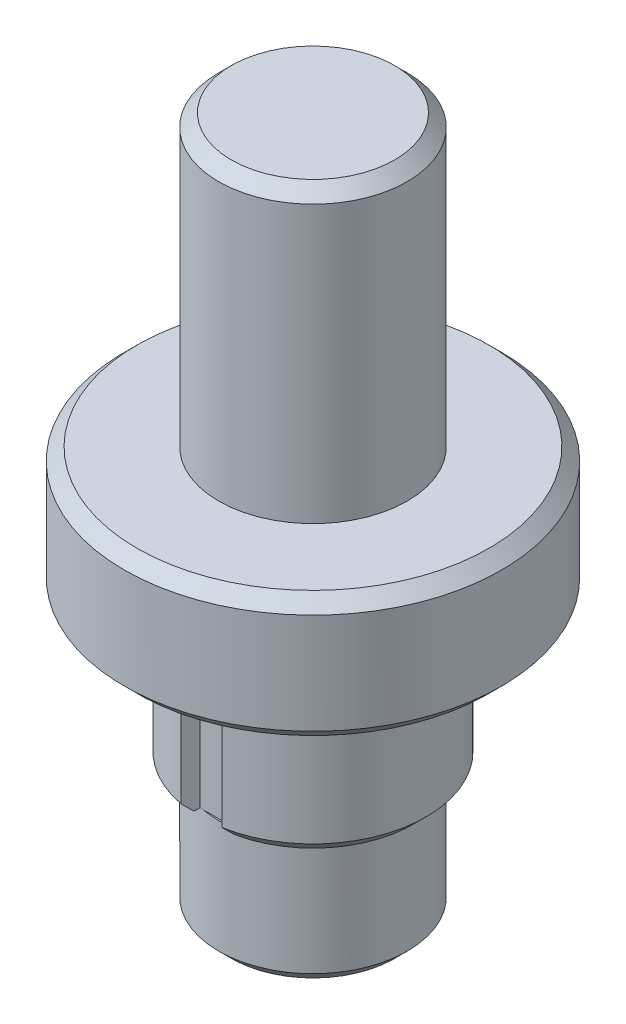
ISO-10303-21;
HEADER;
FILE_DESCRIPTION(('STEP AP214'),'2;1');
FILE_NAME('part.step','',(''),(''),'','','');
FILE_SCHEMA(('AUTOMOTIVE_DESIGN { 1 0 10303 214 1 1 1 1 }'));
ENDSEC;
DATA;
#1=APPLICATION_CONTEXT('core data for automotive mechanical design processes');
#2=APPLICATION_PROTOCOL_DEFINITION('international standard','automotive_design',2000,#1);
#3=PRODUCT_CONTEXT('',#1,'mechanical');
#4=PRODUCT('Part','Part','',(#3));
#5=PRODUCT_RELATED_PRODUCT_CATEGORY('part','',(#4));
#6=PRODUCT_DEFINITION_FORMATION('','',#4);
#7=PRODUCT_DEFINITION_CONTEXT('part definition',#1,'design');
#8=PRODUCT_DEFINITION('design','',#6,#7);
#9=PRODUCT_DEFINITION_SHAPE('','',#8);
#10=(LENGTH_UNIT() NAMED_UNIT(*) SI_UNIT(.MILLI.,.METRE.));
#11=(NAMED_UNIT(*) PLANE_ANGLE_UNIT() SI_UNIT($,.RADIAN.));
#12=(NAMED_UNIT(*) SI_UNIT($,.STERADIAN.) SOLID_ANGLE_UNIT());
#13=UNCERTAINTY_MEASURE_WITH_UNIT(LENGTH_MEASURE(1.E-05),#10,'distance_accuracy_value','');
#14=(GEOMETRIC_REPRESENTATION_CONTEXT(3) GLOBAL_UNCERTAINTY_ASSIGNED_CONTEXT((#13)) GLOBAL_UNIT_ASSIGNED_CONTEXT((#10,
#11,#12)) REPRESENTATION_CONTEXT('',''));
#15=CARTESIAN_POINT('',(0.,0.,0.));
#16=DIRECTION('',(0.,0.,1.));
#17=DIRECTION('',(1.,0.,0.));
#18=AXIS2_PLACEMENT_3D('',#15,#16,#17);
#19=CARTESIAN_POINT('',(7.5,0.,0.));
#20=DIRECTION('',(0.,-1.,0.));
#21=DIRECTION('',(0.,0.,-1.));
#22=AXIS2_PLACEMENT_3D('',#19,#20,#21);
#23=PLANE('',#22);
#24=CARTESIAN_POINT('',(0.,0.,0.));
#25=DIRECTION('',(0.,-1.,0.));
#26=DIRECTION('',(0.,0.,-1.));
#27=AXIS2_PLACEMENT_3D('',#24,#25,#26);
#28=CIRCLE('',#27,6.50000000000001);
#29=CARTESIAN_POINT('',(0.,0.,-6.50000000000001));
#30=VERTEX_POINT('',#29);
#31=EDGE_CURVE('E154',#30,#30,#28,.T.);
#32=ORIENTED_EDGE('',*,*,#31,.T.);
#33=EDGE_LOOP('',(#32));
#34=FACE_BOUND('',#33,.T.);
#35=ADVANCED_FACE('F33',(#34),#23,.T.);
#36=CARTESIAN_POINT('',(0.,55.,0.));
#37=DIRECTION('',(0.,1.,0.));
#38=DIRECTION('',(0.,0.,1.));
#39=AXIS2_PLACEMENT_3D('',#36,#37,#38);
#40=PLANE('',#39);
#41=CARTESIAN_POINT('',(0.,55.,0.));
#42=DIRECTION('',(0.,1.,0.));
#43=DIRECTION('',(0.,0.,1.));
#44=AXIS2_PLACEMENT_3D('',#41,#42,#43);
#45=CIRCLE('',#44,6.50000000000001);
#46=CARTESIAN_POINT('',(0.,55.,6.50000000000001));
#47=VERTEX_POINT('',#46);
#48=EDGE_CURVE('E151',#47,#47,#45,.T.);
#49=ORIENTED_EDGE('',*,*,#48,.T.);
#50=EDGE_LOOP('',(#49));
#51=FACE_BOUND('',#50,.T.);
#52=ADVANCED_FACE('F199',(#51),#40,.T.);
#53=CARTESIAN_POINT('',(0.,0.,0.));
#54=DIRECTION('',(0.,-1.,0.));
#55=DIRECTION('',(0.,0.,-1.));
#56=AXIS2_PLACEMENT_3D('',#53,#54,#55);
#57=CYLINDRICAL_SURFACE('',#56,7.5);
#58=CARTESIAN_POINT('',(0.,54.,0.));
#59=DIRECTION('',(0.,1.,0.));
#60=DIRECTION('',(0.,0.,1.));
#61=AXIS2_PLACEMENT_3D('',#58,#59,#60);
#62=CIRCLE('',#61,7.5);
#63=CARTESIAN_POINT('',(0.,54.,7.50000000000001));
#64=VERTEX_POINT('',#63);
#65=EDGE_CURVE('E144',#64,#64,#62,.F.);
#66=ORIENTED_EDGE('',*,*,#65,.T.);
#67=EDGE_LOOP('',(#66));
#68=FACE_BOUND('',#67,.T.);
#69=CARTESIAN_POINT('',(0.,32.,0.));
#70=DIRECTION('',(0.,-1.,0.));
#71=DIRECTION('',(0.,0.,-1.));
#72=AXIS2_PLACEMENT_3D('',#69,#70,#71);
#73=CIRCLE('',#72,7.5);
#74=CARTESIAN_POINT('',(0.,32.,-7.50000000000001));
#75=VERTEX_POINT('',#74);
#76=EDGE_CURVE('E140',#75,#75,#73,.T.);
#77=ORIENTED_EDGE('',*,*,#76,.F.);
#78=EDGE_LOOP('',(#77));
#79=FACE_BOUND('',#78,.T.);
#80=ADVANCED_FACE('F195',(#68,#79),#57,.T.);
#81=CARTESIAN_POINT('',(15.,32.,0.));
#82=DIRECTION('',(0.,1.,0.));
#83=DIRECTION('',(0.,0.,1.));
#84=AXIS2_PLACEMENT_3D('',#81,#82,#83);
#85=PLANE('',#84);
#86=CARTESIAN_POINT('',(0.,32.,0.));
#87=DIRECTION('',(0.,1.,0.));
#88=DIRECTION('',(0.,0.,1.));
#89=AXIS2_PLACEMENT_3D('',#86,#87,#88);
#90=CIRCLE('',#89,14.);
#91=CARTESIAN_POINT('',(0.,32.,14.));
#92=VERTEX_POINT('',#91);
#93=EDGE_CURVE('E11',#92,#92,#90,.T.);
#94=ORIENTED_EDGE('',*,*,#93,.T.);
#95=EDGE_LOOP('',(#94));
#96=FACE_BOUND('',#95,.T.);
#97=ORIENTED_EDGE('',*,*,#76,.T.);
#98=EDGE_LOOP('',(#97));
#99=FACE_BOUND('',#98,.T.);
#100=ADVANCED_FACE('F191',(#96,#99),#85,.T.);
#101=CARTESIAN_POINT('',(0.,0.,0.));
#102=DIRECTION('',(0.,-1.,0.));
#103=DIRECTION('',(0.,0.,-1.));
#104=AXIS2_PLACEMENT_3D('',#101,#102,#103);
#105=CYLINDRICAL_SURFACE('',#104,15.);
#106=CARTESIAN_POINT('',(0.,23.,0.));
#107=DIRECTION('',(0.,-1.,0.));
#108=DIRECTION('',(0.,0.,-1.));
#109=AXIS2_PLACEMENT_3D('',#106,#107,#108);
#110=CIRCLE('',#109,15.);
#111=CARTESIAN_POINT('',(0.,23.,-15.));
#112=VERTEX_POINT('',#111);
#113=EDGE_CURVE('E41',#112,#112,#110,.F.);
#114=ORIENTED_EDGE('',*,*,#113,.T.);
#115=EDGE_LOOP('',(#114));
#116=FACE_BOUND('',#115,.T.);
#117=CARTESIAN_POINT('',(0.,31.,0.));
#118=DIRECTION('',(0.,1.,0.));
#119=DIRECTION('',(0.,0.,1.));
#120=AXIS2_PLACEMENT_3D('',#117,#118,#119);
#121=CIRCLE('',#120,15.);
#122=CARTESIAN_POINT('',(0.,31.,15.));
#123=VERTEX_POINT('',#122);
#124=EDGE_CURVE('E268',#123,#123,#121,.F.);
#125=ORIENTED_EDGE('',*,*,#124,.T.);
#126=EDGE_LOOP('',(#125));
#127=FACE_BOUND('',#126,.T.);
#128=ADVANCED_FACE('F187',(#116,#127),#105,.T.);
#129=CARTESIAN_POINT('',(9.00000000000002,22.,0.));
#130=DIRECTION('',(0.,-1.,0.));
#131=DIRECTION('',(0.,0.,-1.));
#132=AXIS2_PLACEMENT_3D('',#129,#130,#131);
#133=PLANE('',#132);
#134=CARTESIAN_POINT('',(0.,22.,0.));
#135=DIRECTION('',(0.,-1.,0.));
#136=DIRECTION('',(0.,0.,-1.));
#137=AXIS2_PLACEMENT_3D('',#134,#135,#136);
#138=CIRCLE('',#137,14.);
#139=CARTESIAN_POINT('',(0.,22.,-14.));
#140=VERTEX_POINT('',#139);
#141=EDGE_CURVE('E270',#140,#140,#138,.T.);
#142=ORIENTED_EDGE('',*,*,#141,.T.);
#143=EDGE_LOOP('',(#142));
#144=FACE_BOUND('',#143,.T.);
#145=CARTESIAN_POINT('',(0.,22.,0.));
#146=DIRECTION('',(0.,-1.,0.));
#147=DIRECTION('',(0.,0.,-1.));
#148=AXIS2_PLACEMENT_3D('',#145,#146,#147);
#149=CIRCLE('',#148,9.00000000000001);
#150=CARTESIAN_POINT('',(-1.62499999999999,22.,8.85208308817762));
#151=VERTEX_POINT('',#150);
#152=CARTESIAN_POINT('',(1.625,22.,8.85208308817762));
#153=VERTEX_POINT('',#152);
#154=EDGE_CURVE('E136',#151,#153,#149,.T.);
#155=ORIENTED_EDGE('',*,*,#154,.F.);
#156=DIRECTION('',(0.,0.,1.));
#157=VECTOR('',#156,1.);
#158=CARTESIAN_POINT('',(-1.625,22.,10.625));
#159=LINE('',#158,#157);
#160=CARTESIAN_POINT('',(-1.62499999999999,22.,7.37500000000001));
#161=VERTEX_POINT('',#160);
#162=EDGE_CURVE('E125',#161,#151,#159,.T.);
#163=ORIENTED_EDGE('',*,*,#162,.F.);
#164=DIRECTION('',(-1.,0.,0.));
#165=VECTOR('',#164,1.);
#166=CARTESIAN_POINT('',(-1.62499999999999,22.,7.37500000000001));
#167=LINE('',#166,#165);
#168=CARTESIAN_POINT('',(1.62500000000002,22.,7.37500000000002));
#169=VERTEX_POINT('',#168);
#170=EDGE_CURVE('E107',#169,#161,#167,.T.);
#171=ORIENTED_EDGE('',*,*,#170,.F.);
#172=DIRECTION('',(0.,0.,-1.));
#173=VECTOR('',#172,1.);
#174=CARTESIAN_POINT('',(1.625,22.,10.625));
#175=LINE('',#174,#173);
#176=EDGE_CURVE('E124',#153,#169,#175,.T.);
#177=ORIENTED_EDGE('',*,*,#176,.F.);
#178=EDGE_LOOP('',(#155,#163,#171,#177));
#179=FACE_BOUND('',#178,.T.);
#180=ADVANCED_FACE('F139',(#144,#179),#133,.T.);
#181=CARTESIAN_POINT('',(0.,0.,0.));
#182=DIRECTION('',(0.,-1.,0.));
#183=DIRECTION('',(0.,0.,-1.));
#184=AXIS2_PLACEMENT_3D('',#181,#182,#183);
#185=CYLINDRICAL_SURFACE('',#184,9.00000000000001);
#186=DIRECTION('',(0.,-1.,0.));
#187=VECTOR('',#186,1.);
#188=CARTESIAN_POINT('',(1.625,0.,8.85208308817762));
#189=LINE('',#188,#187);
#190=CARTESIAN_POINT('',(1.625,11.,8.85208308817762));
#191=VERTEX_POINT('',#190);
#192=EDGE_CURVE('E137',#191,#153,#189,.F.);
#193=ORIENTED_EDGE('',*,*,#192,.F.);
#194=CARTESIAN_POINT('',(0.,11.,0.));
#195=DIRECTION('',(0.,-1.,0.));
#196=DIRECTION('',(0.,0.,-1.));
#197=AXIS2_PLACEMENT_3D('',#194,#195,#196);
#198=CIRCLE('',#197,9.00000000000001);
#199=CARTESIAN_POINT('',(-1.62499999999999,11.,8.85208308817762));
#200=VERTEX_POINT('',#199);
#201=EDGE_CURVE('E48',#191,#200,#198,.F.);
#202=ORIENTED_EDGE('',*,*,#201,.T.);
#203=DIRECTION('',(0.,-1.,0.));
#204=VECTOR('',#203,1.);
#205=CARTESIAN_POINT('',(-1.62499999999999,0.,8.85208308817762));
#206=LINE('',#205,#204);
#207=EDGE_CURVE('E130',#151,#200,#206,.T.);
#208=ORIENTED_EDGE('',*,*,#207,.F.);
#209=ORIENTED_EDGE('',*,*,#154,.T.);
#210=EDGE_LOOP('',(#193,#202,#208,#209));
#211=FACE_BOUND('',#210,.T.);
#212=ADVANCED_FACE('F135',(#211),#185,.T.);
#213=CARTESIAN_POINT('',(9.00000000000002,10.,0.));
#214=DIRECTION('',(0.,-1.,0.));
#215=DIRECTION('',(0.,0.,-1.));
#216=AXIS2_PLACEMENT_3D('',#213,#214,#215);
#217=PLANE('',#216);
#218=DIRECTION('',(0.,0.,-1.));
#219=VECTOR('',#218,1.);
#220=CARTESIAN_POINT('',(-1.625,10.,10.625));
#221=LINE('',#220,#219);
#222=CARTESIAN_POINT('',(-1.62500000000001,10.,7.83322251694667));
#223=VERTEX_POINT('',#222);
#224=CARTESIAN_POINT('',(-1.62499999999999,10.,7.37500000000001));
#225=VERTEX_POINT('',#224);
#226=EDGE_CURVE('E87',#223,#225,#221,.T.);
#227=ORIENTED_EDGE('',*,*,#226,.F.);
#228=CARTESIAN_POINT('',(0.,10.,0.));
#229=DIRECTION('',(0.,-1.,0.));
#230=DIRECTION('',(0.,0.,-1.));
#231=AXIS2_PLACEMENT_3D('',#228,#229,#230);
#232=CIRCLE('',#231,8.00000000000001);
#233=CARTESIAN_POINT('',(1.62499999999999,10.,7.83322251694666));
#234=VERTEX_POINT('',#233);
#235=EDGE_CURVE('E126',#223,#234,#232,.T.);
#236=ORIENTED_EDGE('',*,*,#235,.T.);
#237=DIRECTION('',(0.,0.,1.));
#238=VECTOR('',#237,1.);
#239=CARTESIAN_POINT('',(1.625,10.,10.625));
#240=LINE('',#239,#238);
#241=CARTESIAN_POINT('',(1.62500000000002,10.,7.37500000000002));
#242=VERTEX_POINT('',#241);
#243=EDGE_CURVE('E98',#242,#234,#240,.T.);
#244=ORIENTED_EDGE('',*,*,#243,.F.);
#245=DIRECTION('',(1.,0.,0.));
#246=VECTOR('',#245,1.);
#247=CARTESIAN_POINT('',(-1.62499999999999,10.,7.37500000000001));
#248=LINE('',#247,#246);
#249=CARTESIAN_POINT('',(1.36358901432942,10.,7.37500000000002));
#250=VERTEX_POINT('',#249);
#251=EDGE_CURVE('E97',#250,#242,#248,.T.);
#252=ORIENTED_EDGE('',*,*,#251,.F.);
#253=CARTESIAN_POINT('',(0.,10.,0.));
#254=DIRECTION('',(0.,-1.,0.));
#255=DIRECTION('',(0.,0.,-1.));
#256=AXIS2_PLACEMENT_3D('',#253,#254,#255);
#257=CIRCLE('',#256,7.5);
#258=CARTESIAN_POINT('',(-1.36358901432944,10.,7.37500000000001));
#259=VERTEX_POINT('',#258);
#260=EDGE_CURVE('E115',#259,#250,#257,.T.);
#261=ORIENTED_EDGE('',*,*,#260,.F.);
#262=EDGE_CURVE('E103',#225,#259,#248,.T.);
#263=ORIENTED_EDGE('',*,*,#262,.F.);
#264=EDGE_LOOP('',(#227,#236,#244,#252,#261,#263));
#265=FACE_BOUND('',#264,.T.);
#266=ADVANCED_FACE('F112',(#265),#217,.T.);
#267=CARTESIAN_POINT('',(0.,0.,0.));
#268=DIRECTION('',(0.,-1.,0.));
#269=DIRECTION('',(0.,0.,-1.));
#270=AXIS2_PLACEMENT_3D('',#267,#268,#269);
#271=CYLINDRICAL_SURFACE('',#270,7.5);
#272=CARTESIAN_POINT('',(0.,1.,0.));
#273=DIRECTION('',(0.,-1.,0.));
#274=DIRECTION('',(0.,0.,-1.));
#275=AXIS2_PLACEMENT_3D('',#272,#273,#274);
#276=CIRCLE('',#275,7.5);
#277=CARTESIAN_POINT('',(0.,1.,-7.50000000000001));
#278=VERTEX_POINT('',#277);
#279=EDGE_CURVE('E157',#278,#278,#276,.F.);
#280=ORIENTED_EDGE('',*,*,#279,.T.);
#281=EDGE_LOOP('',(#280));
#282=FACE_BOUND('',#281,.T.);
#283=EDGE_CURVE('E141',#250,#259,#257,.T.);
#284=ORIENTED_EDGE('',*,*,#283,.T.);
#285=ORIENTED_EDGE('',*,*,#260,.T.);
#286=EDGE_LOOP('',(#284,#285));
#287=FACE_BOUND('',#286,.T.);
#288=ADVANCED_FACE('F175',(#282,#287),#271,.T.);
#289=CARTESIAN_POINT('',(1.625,26.5961940777126,10.625));
#290=DIRECTION('',(1.,0.,0.));
#291=DIRECTION('',(0.,0.,-1.));
#292=AXIS2_PLACEMENT_3D('',#289,#290,#291);
#293=PLANE('',#292);
#294=ORIENTED_EDGE('',*,*,#243,.T.);
#295=CARTESIAN_POINT('',(1.62499999999999,10.,7.83322251694666));
#296=CARTESIAN_POINT('',(1.625,10.1664765311696,8.00321923411533));
#297=CARTESIAN_POINT('',(1.625,10.3330481316261,8.17312264186607));
#298=CARTESIAN_POINT('',(1.625,10.6663814649664,8.51274283226951));
#299=CARTESIAN_POINT('',(1.625,10.8331431978433,8.68245961492909));
#300=CARTESIAN_POINT('',(1.625,11.,8.85208308817762));
#301=B_SPLINE_CURVE_WITH_KNOTS('',3,(#295,#296,#297,#298,#299,#300),.UNSPECIFIED.,.F.,.F.,(4,2,
4),(0.,0.713806272314463,1.42761251830545),.UNSPECIFIED.);
#302=EDGE_CURVE('E56',#234,#191,#301,.T.);
#303=ORIENTED_EDGE('',*,*,#302,.T.);
#304=ORIENTED_EDGE('',*,*,#192,.T.);
#305=ORIENTED_EDGE('',*,*,#176,.T.);
#306=DIRECTION('',(0.,-1.,0.));
#307=VECTOR('',#306,1.);
#308=CARTESIAN_POINT('',(1.62500000000002,26.5961940777126,7.37500000000002));
#309=LINE('',#308,#307);
#310=EDGE_CURVE('E109',#169,#242,#309,.T.);
#311=ORIENTED_EDGE('',*,*,#310,.T.);
#312=EDGE_LOOP('',(#294,#303,#304,#305,#311));
#313=FACE_BOUND('',#312,.T.);
#314=ADVANCED_FACE('F122',(#313),#293,.F.);
#315=CARTESIAN_POINT('',(-1.62499999999999,26.5961940777126,7.37500000000001));
#316=DIRECTION('',(0.,0.,-1.));
#317=DIRECTION('',(-1.,0.,0.));
#318=AXIS2_PLACEMENT_3D('',#315,#316,#317);
#319=PLANE('',#318);
#320=ORIENTED_EDGE('',*,*,#170,.T.);
#321=DIRECTION('',(0.,-1.,0.));
#322=VECTOR('',#321,1.);
#323=CARTESIAN_POINT('',(-1.62499999999999,26.5961940777126,7.37500000000001));
#324=LINE('',#323,#322);
#325=EDGE_CURVE('E90',#161,#225,#324,.T.);
#326=ORIENTED_EDGE('',*,*,#325,.T.);
#327=ORIENTED_EDGE('',*,*,#262,.T.);
#328=EDGE_CURVE('E117',#259,#250,#248,.T.);
#329=ORIENTED_EDGE('',*,*,#328,.T.);
#330=ORIENTED_EDGE('',*,*,#251,.T.);
#331=ORIENTED_EDGE('',*,*,#310,.F.);
#332=EDGE_LOOP('',(#320,#326,#327,#329,#330,#331));
#333=FACE_BOUND('',#332,.T.);
#334=ADVANCED_FACE('F101',(#333),#319,.F.);
#335=CARTESIAN_POINT('',(-1.625,26.5961940777126,10.625));
#336=DIRECTION('',(-1.,0.,0.));
#337=DIRECTION('',(0.,0.,1.));
#338=AXIS2_PLACEMENT_3D('',#335,#336,#337);
#339=PLANE('',#338);
#340=ORIENTED_EDGE('',*,*,#207,.T.);
#341=CARTESIAN_POINT('',(-1.62499999999999,11.,8.85208308817762));
#342=CARTESIAN_POINT('',(-1.625,10.8331431978433,8.68245961492909));
#343=CARTESIAN_POINT('',(-1.625,10.6663814649664,8.51274283226951));
#344=CARTESIAN_POINT('',(-1.625,10.3330481316261,8.17312264186607));
#345=CARTESIAN_POINT('',(-1.62500000000001,10.1664765311696,8.00321923411533));
#346=CARTESIAN_POINT('',(-1.62500000000001,10.,7.83322251694667));
#347=B_SPLINE_CURVE_WITH_KNOTS('',3,(#341,#342,#343,#344,#345,#346),.UNSPECIFIED.,.F.,.F.,(4,2,
4),(0.,0.713806245990978,1.42761251830544),.UNSPECIFIED.);
#348=EDGE_CURVE('E92',#200,#223,#347,.T.);
#349=ORIENTED_EDGE('',*,*,#348,.T.);
#350=ORIENTED_EDGE('',*,*,#226,.T.);
#351=ORIENTED_EDGE('',*,*,#325,.F.);
#352=ORIENTED_EDGE('',*,*,#162,.T.);
#353=EDGE_LOOP('',(#340,#349,#350,#351,#352));
#354=FACE_BOUND('',#353,.T.);
#355=ADVANCED_FACE('F89',(#354),#339,.F.);
#356=CARTESIAN_POINT('',(0.,10.,0.));
#357=DIRECTION('',(0.,-1.,0.));
#358=DIRECTION('',(0.,0.,-1.));
#359=AXIS2_PLACEMENT_3D('',#356,#357,#358);
#360=PLANE('',#359);
#361=ORIENTED_EDGE('',*,*,#283,.F.);
#362=ORIENTED_EDGE('',*,*,#328,.F.);
#363=EDGE_LOOP('',(#361,#362));
#364=FACE_BOUND('',#363,.T.);
#365=ADVANCED_FACE('F210',(#364),#360,.F.);
#366=CARTESIAN_POINT('',(0.,54.,0.));
#367=DIRECTION('',(0.,-1.,0.));
#368=DIRECTION('',(0.,0.,-1.));
#369=AXIS2_PLACEMENT_3D('',#366,#367,#368);
#370=CONICAL_SURFACE('',#369,7.5,0.785398163397451);
#371=ORIENTED_EDGE('',*,*,#48,.F.);
#372=EDGE_LOOP('',(#371));
#373=FACE_BOUND('',#372,.T.);
#374=ORIENTED_EDGE('',*,*,#65,.F.);
#375=EDGE_LOOP('',(#374));
#376=FACE_BOUND('',#375,.T.);
#377=ADVANCED_FACE('F207',(#373,#376),#370,.T.);
#378=CARTESIAN_POINT('',(0.,0.,0.));
#379=DIRECTION('',(0.,1.,0.));
#380=DIRECTION('',(0.,0.,1.));
#381=AXIS2_PLACEMENT_3D('',#378,#379,#380);
#382=CONICAL_SURFACE('',#381,6.50000000000001,0.785398163397446);
#383=ORIENTED_EDGE('',*,*,#279,.F.);
#384=EDGE_LOOP('',(#383));
#385=FACE_BOUND('',#384,.T.);
#386=ORIENTED_EDGE('',*,*,#31,.F.);
#387=EDGE_LOOP('',(#386));
#388=FACE_BOUND('',#387,.T.);
#389=ADVANCED_FACE('F209',(#385,#388),#382,.T.);
#390=CARTESIAN_POINT('',(0.,10.,0.));
#391=DIRECTION('',(0.,1.,0.));
#392=DIRECTION('',(0.,0.,1.));
#393=AXIS2_PLACEMENT_3D('',#390,#391,#392);
#394=CONICAL_SURFACE('',#393,8.00000000000001,0.785398163397447);
#395=ORIENTED_EDGE('',*,*,#348,.F.);
#396=ORIENTED_EDGE('',*,*,#201,.F.);
#397=ORIENTED_EDGE('',*,*,#302,.F.);
#398=ORIENTED_EDGE('',*,*,#235,.F.);
#399=EDGE_LOOP('',(#395,#396,#397,#398));
#400=FACE_BOUND('',#399,.T.);
#401=ADVANCED_FACE('F168',(#400),#394,.T.);
#402=CARTESIAN_POINT('',(0.,22.,0.));
#403=DIRECTION('',(0.,1.,0.));
#404=DIRECTION('',(0.,0.,1.));
#405=AXIS2_PLACEMENT_3D('',#402,#403,#404);
#406=CONICAL_SURFACE('',#405,14.,0.785398163397447);
#407=ORIENTED_EDGE('',*,*,#113,.F.);
#408=EDGE_LOOP('',(#407));
#409=FACE_BOUND('',#408,.T.);
#410=ORIENTED_EDGE('',*,*,#141,.F.);
#411=EDGE_LOOP('',(#410));
#412=FACE_BOUND('',#411,.T.);
#413=ADVANCED_FACE('F217',(#409,#412),#406,.T.);
#414=CARTESIAN_POINT('',(0.,31.,0.));
#415=DIRECTION('',(0.,-1.,0.));
#416=DIRECTION('',(0.,0.,-1.));
#417=AXIS2_PLACEMENT_3D('',#414,#415,#416);
#418=CONICAL_SURFACE('',#417,15.,0.785398163397457);
#419=ORIENTED_EDGE('',*,*,#93,.F.);
#420=EDGE_LOOP('',(#419));
#421=FACE_BOUND('',#420,.T.);
#422=ORIENTED_EDGE('',*,*,#124,.F.);
#423=EDGE_LOOP('',(#422));
#424=FACE_BOUND('',#423,.T.);
#425=ADVANCED_FACE('F35',(#421,#424),#418,.T.);
#426=CLOSED_SHELL('',(#35,#52,#80,#100,#128,#180,#212,#266,#288,#314,#334,#355,#365,#377,#389,
#401,#413,#425));
#427=MANIFOLD_SOLID_BREP('B2',#426);
#428=ADVANCED_BREP_SHAPE_REPRESENTATION('',(#18,#427),#14);
#429=SHAPE_DEFINITION_REPRESENTATION(#9,#428);
ENDSEC;
END-ISO-10303-21;
